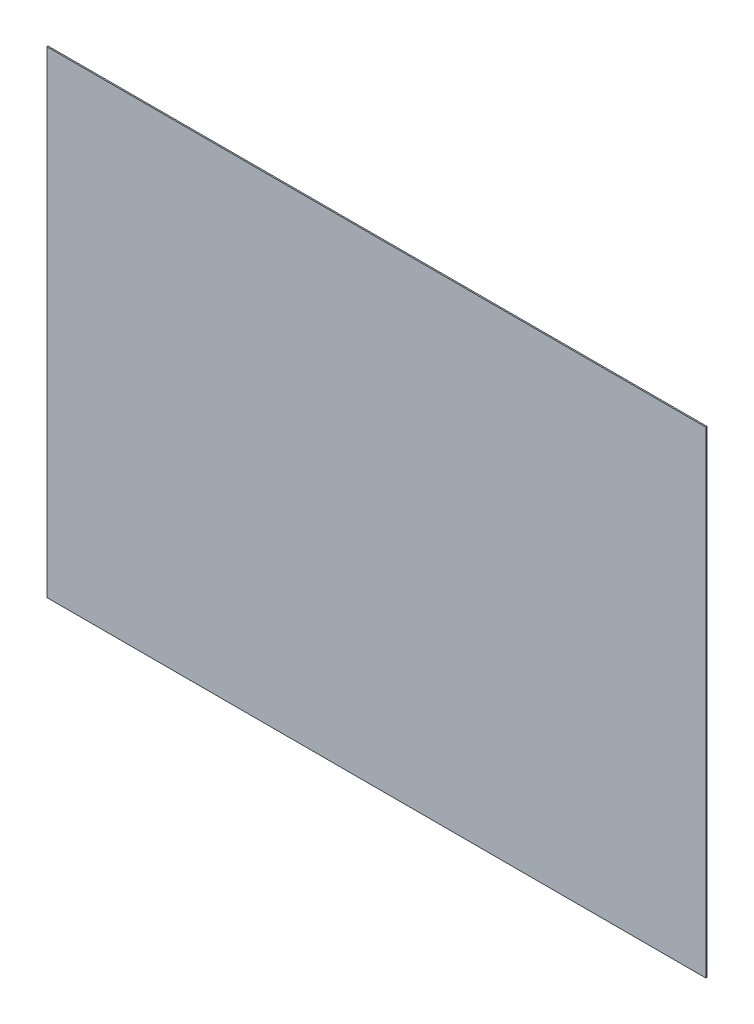
ISO-10303-21;
HEADER;
FILE_DESCRIPTION(('STEP AP214'),'2;1');
FILE_NAME('part.step','',(''),(''),'','','');
FILE_SCHEMA(('AUTOMOTIVE_DESIGN { 1 0 10303 214 1 1 1 1 }'));
ENDSEC;
DATA;
#1=APPLICATION_CONTEXT('core data for automotive mechanical design processes');
#2=APPLICATION_PROTOCOL_DEFINITION('international standard','automotive_design',2000,#1);
#3=PRODUCT_CONTEXT('',#1,'mechanical');
#4=PRODUCT('Part','Part','',(#3));
#5=PRODUCT_RELATED_PRODUCT_CATEGORY('part','',(#4));
#6=PRODUCT_DEFINITION_FORMATION('','',#4);
#7=PRODUCT_DEFINITION_CONTEXT('part definition',#1,'design');
#8=PRODUCT_DEFINITION('design','',#6,#7);
#9=PRODUCT_DEFINITION_SHAPE('','',#8);
#10=(LENGTH_UNIT() NAMED_UNIT(*) SI_UNIT(.MILLI.,.METRE.));
#11=(NAMED_UNIT(*) PLANE_ANGLE_UNIT() SI_UNIT($,.RADIAN.));
#12=(NAMED_UNIT(*) SI_UNIT($,.STERADIAN.) SOLID_ANGLE_UNIT());
#13=UNCERTAINTY_MEASURE_WITH_UNIT(LENGTH_MEASURE(1.E-05),#10,'distance_accuracy_value','');
#14=(GEOMETRIC_REPRESENTATION_CONTEXT(3) GLOBAL_UNCERTAINTY_ASSIGNED_CONTEXT((#13)) GLOBAL_UNIT_ASSIGNED_CONTEXT((#10,
#11,#12)) REPRESENTATION_CONTEXT('',''));
#15=CARTESIAN_POINT('',(0.,0.,0.));
#16=DIRECTION('',(0.,0.,1.));
#17=DIRECTION('',(1.,0.,0.));
#18=AXIS2_PLACEMENT_3D('',#15,#16,#17);
#19=CARTESIAN_POINT('',(0.,0.,2.9));
#20=DIRECTION('',(1.,0.,0.));
#21=DIRECTION('',(0.,1.,0.));
#22=AXIS2_PLACEMENT_3D('',#19,#20,#21);
#23=PLANE('',#22);
#24=DIRECTION('',(0.,-1.,0.));
#25=VECTOR('',#24,1.);
#26=CARTESIAN_POINT('',(0.,0.,0.));
#27=LINE('',#26,#25);
#28=CARTESIAN_POINT('',(0.,0.,0.));
#29=VERTEX_POINT('',#28);
#30=CARTESIAN_POINT('',(1.34711147906209E-13,-1100.,0.));
#31=VERTEX_POINT('',#30);
#32=EDGE_CURVE('E99',#29,#31,#27,.T.);
#33=ORIENTED_EDGE('',*,*,#32,.T.);
#34=DIRECTION('',(0.,0.,-1.));
#35=VECTOR('',#34,1.);
#36=CARTESIAN_POINT('',(1.34711147906209E-13,-1100.,2.9));
#37=LINE('',#36,#35);
#38=CARTESIAN_POINT('',(1.34711147906209E-13,-1100.,2.9));
#39=VERTEX_POINT('',#38);
#40=EDGE_CURVE('E11',#39,#31,#37,.T.);
#41=ORIENTED_EDGE('',*,*,#40,.F.);
#42=DIRECTION('',(0.,-1.,0.));
#43=VECTOR('',#42,1.);
#44=CARTESIAN_POINT('',(0.,0.,2.9));
#45=LINE('',#44,#43);
#46=CARTESIAN_POINT('',(0.,0.,2.9));
#47=VERTEX_POINT('',#46);
#48=EDGE_CURVE('E87',#47,#39,#45,.T.);
#49=ORIENTED_EDGE('',*,*,#48,.F.);
#50=DIRECTION('',(0.,0.,-1.));
#51=VECTOR('',#50,1.);
#52=CARTESIAN_POINT('',(0.,0.,2.9));
#53=LINE('',#52,#51);
#54=EDGE_CURVE('E95',#47,#29,#53,.T.);
#55=ORIENTED_EDGE('',*,*,#54,.T.);
#56=EDGE_LOOP('',(#33,#41,#49,#55));
#57=FACE_BOUND('',#56,.T.);
#58=ADVANCED_FACE('F36',(#57),#23,.F.);
#59=CARTESIAN_POINT('',(1.34711147906209E-13,-1100.,2.9));
#60=DIRECTION('',(0.,1.,0.));
#61=DIRECTION('',(0.,0.,1.));
#62=AXIS2_PLACEMENT_3D('',#59,#60,#61);
#63=PLANE('',#62);
#64=DIRECTION('',(1.,0.,0.));
#65=VECTOR('',#64,1.);
#66=CARTESIAN_POINT('',(1.34711147906209E-13,-1100.,0.));
#67=LINE('',#66,#65);
#68=CARTESIAN_POINT('',(1519.3,-1100.,0.));
#69=VERTEX_POINT('',#68);
#70=EDGE_CURVE('E91',#31,#69,#67,.T.);
#71=ORIENTED_EDGE('',*,*,#70,.T.);
#72=DIRECTION('',(0.,0.,-1.));
#73=VECTOR('',#72,1.);
#74=CARTESIAN_POINT('',(1519.3,-1100.,2.9));
#75=LINE('',#74,#73);
#76=CARTESIAN_POINT('',(1519.3,-1100.,2.9));
#77=VERTEX_POINT('',#76);
#78=EDGE_CURVE('E44',#77,#69,#75,.T.);
#79=ORIENTED_EDGE('',*,*,#78,.F.);
#80=DIRECTION('',(1.,0.,0.));
#81=VECTOR('',#80,1.);
#82=CARTESIAN_POINT('',(1.34711147906209E-13,-1100.,2.9));
#83=LINE('',#82,#81);
#84=EDGE_CURVE('E82',#39,#77,#83,.T.);
#85=ORIENTED_EDGE('',*,*,#84,.F.);
#86=ORIENTED_EDGE('',*,*,#40,.T.);
#87=EDGE_LOOP('',(#71,#79,#85,#86));
#88=FACE_BOUND('',#87,.T.);
#89=ADVANCED_FACE('F90',(#88),#63,.F.);
#90=CARTESIAN_POINT('',(1519.3,0.,2.9));
#91=DIRECTION('',(-1.,0.,0.));
#92=DIRECTION('',(0.,-1.,0.));
#93=AXIS2_PLACEMENT_3D('',#90,#91,#92);
#94=PLANE('',#93);
#95=DIRECTION('',(0.,1.,0.));
#96=VECTOR('',#95,1.);
#97=CARTESIAN_POINT('',(1519.3,0.,0.));
#98=LINE('',#97,#96);
#99=CARTESIAN_POINT('',(1519.3,0.,0.));
#100=VERTEX_POINT('',#99);
#101=EDGE_CURVE('E69',#69,#100,#98,.T.);
#102=ORIENTED_EDGE('',*,*,#101,.T.);
#103=DIRECTION('',(0.,0.,-1.));
#104=VECTOR('',#103,1.);
#105=CARTESIAN_POINT('',(1519.3,0.,2.9));
#106=LINE('',#105,#104);
#107=CARTESIAN_POINT('',(1519.3,0.,2.9));
#108=VERTEX_POINT('',#107);
#109=EDGE_CURVE('E92',#108,#100,#106,.T.);
#110=ORIENTED_EDGE('',*,*,#109,.F.);
#111=DIRECTION('',(0.,1.,0.));
#112=VECTOR('',#111,1.);
#113=CARTESIAN_POINT('',(1519.3,0.,2.9));
#114=LINE('',#113,#112);
#115=EDGE_CURVE('E85',#77,#108,#114,.T.);
#116=ORIENTED_EDGE('',*,*,#115,.F.);
#117=ORIENTED_EDGE('',*,*,#78,.T.);
#118=EDGE_LOOP('',(#102,#110,#116,#117));
#119=FACE_BOUND('',#118,.T.);
#120=ADVANCED_FACE('F93',(#119),#94,.F.);
#121=CARTESIAN_POINT('',(0.,0.,2.9));
#122=DIRECTION('',(0.,-1.,0.));
#123=DIRECTION('',(0.,0.,-1.));
#124=AXIS2_PLACEMENT_3D('',#121,#122,#123);
#125=PLANE('',#124);
#126=DIRECTION('',(-1.,0.,0.));
#127=VECTOR('',#126,1.);
#128=CARTESIAN_POINT('',(0.,0.,0.));
#129=LINE('',#128,#127);
#130=EDGE_CURVE('E75',#100,#29,#129,.T.);
#131=ORIENTED_EDGE('',*,*,#130,.T.);
#132=ORIENTED_EDGE('',*,*,#54,.F.);
#133=DIRECTION('',(-1.,0.,0.));
#134=VECTOR('',#133,1.);
#135=CARTESIAN_POINT('',(0.,0.,2.9));
#136=LINE('',#135,#134);
#137=EDGE_CURVE('E52',#108,#47,#136,.T.);
#138=ORIENTED_EDGE('',*,*,#137,.F.);
#139=ORIENTED_EDGE('',*,*,#109,.T.);
#140=EDGE_LOOP('',(#131,#132,#138,#139));
#141=FACE_BOUND('',#140,.T.);
#142=ADVANCED_FACE('F106',(#141),#125,.F.);
#143=CARTESIAN_POINT('',(0.,0.,2.9));
#144=DIRECTION('',(0.,0.,1.));
#145=DIRECTION('',(1.,0.,0.));
#146=AXIS2_PLACEMENT_3D('',#143,#144,#145);
#147=PLANE('',#146);
#148=ORIENTED_EDGE('',*,*,#48,.T.);
#149=ORIENTED_EDGE('',*,*,#84,.T.);
#150=ORIENTED_EDGE('',*,*,#115,.T.);
#151=ORIENTED_EDGE('',*,*,#137,.T.);
#152=EDGE_LOOP('',(#148,#149,#150,#151));
#153=FACE_BOUND('',#152,.T.);
#154=ADVANCED_FACE('F83',(#153),#147,.T.);
#155=CARTESIAN_POINT('',(0.,0.,0.));
#156=DIRECTION('',(0.,0.,1.));
#157=DIRECTION('',(1.,0.,0.));
#158=AXIS2_PLACEMENT_3D('',#155,#156,#157);
#159=PLANE('',#158);
#160=ORIENTED_EDGE('',*,*,#32,.F.);
#161=ORIENTED_EDGE('',*,*,#130,.F.);
#162=ORIENTED_EDGE('',*,*,#101,.F.);
#163=ORIENTED_EDGE('',*,*,#70,.F.);
#164=EDGE_LOOP('',(#160,#161,#162,#163));
#165=FACE_BOUND('',#164,.T.);
#166=ADVANCED_FACE('F109',(#165),#159,.F.);
#167=CLOSED_SHELL('',(#58,#89,#120,#142,#154,#166));
#168=MANIFOLD_SOLID_BREP('B2',#167);
#169=ADVANCED_BREP_SHAPE_REPRESENTATION('',(#18,#168),#14);
#170=SHAPE_DEFINITION_REPRESENTATION(#9,#169);
ENDSEC;
END-ISO-10303-21;
